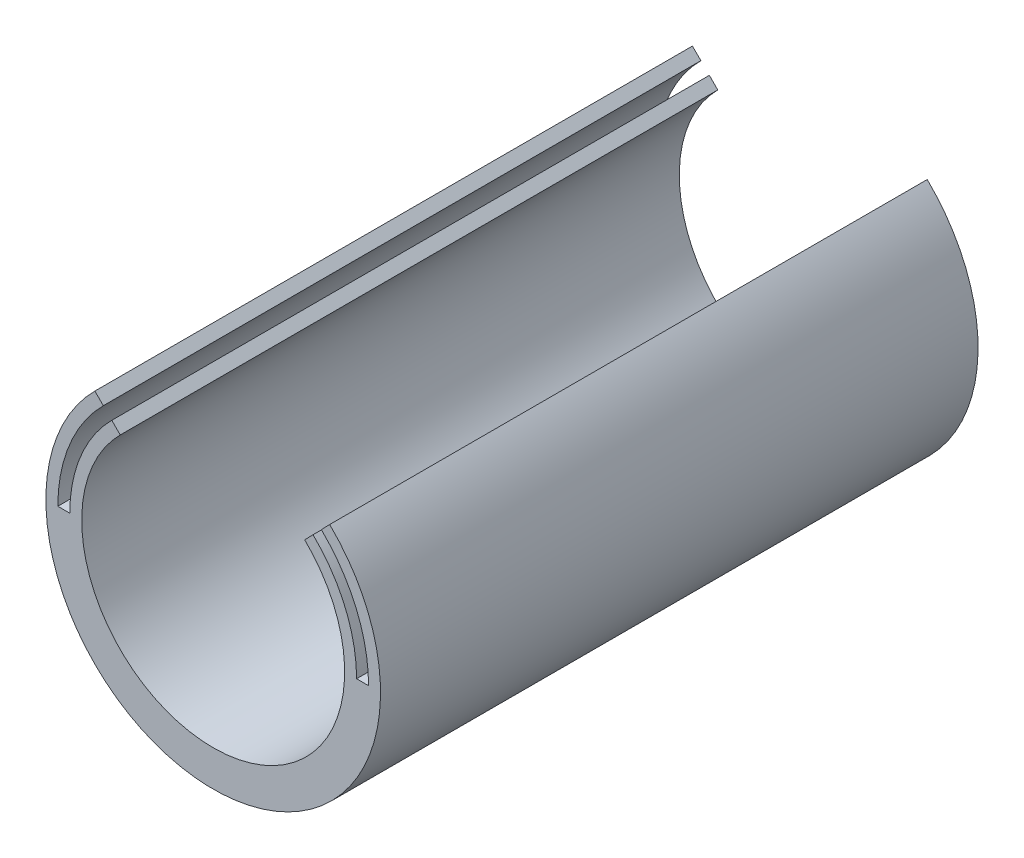
ISO-10303-21;
HEADER;
FILE_DESCRIPTION(('STEP AP214'),'2;1');
FILE_NAME('part.step','',(''),(''),'','','');
FILE_SCHEMA(('AUTOMOTIVE_DESIGN { 1 0 10303 214 1 1 1 1 }'));
ENDSEC;
DATA;
#1=APPLICATION_CONTEXT('core data for automotive mechanical design processes');
#2=APPLICATION_PROTOCOL_DEFINITION('international standard','automotive_design',2000,#1);
#3=PRODUCT_CONTEXT('',#1,'mechanical');
#4=PRODUCT('Part','Part','',(#3));
#5=PRODUCT_RELATED_PRODUCT_CATEGORY('part','',(#4));
#6=PRODUCT_DEFINITION_FORMATION('','',#4);
#7=PRODUCT_DEFINITION_CONTEXT('part definition',#1,'design');
#8=PRODUCT_DEFINITION('design','',#6,#7);
#9=PRODUCT_DEFINITION_SHAPE('','',#8);
#10=(LENGTH_UNIT() NAMED_UNIT(*) SI_UNIT(.MILLI.,.METRE.));
#11=(NAMED_UNIT(*) PLANE_ANGLE_UNIT() SI_UNIT($,.RADIAN.));
#12=(NAMED_UNIT(*) SI_UNIT($,.STERADIAN.) SOLID_ANGLE_UNIT());
#13=UNCERTAINTY_MEASURE_WITH_UNIT(LENGTH_MEASURE(1.E-05),#10,'distance_accuracy_value','');
#14=(GEOMETRIC_REPRESENTATION_CONTEXT(3) GLOBAL_UNCERTAINTY_ASSIGNED_CONTEXT((#13)) GLOBAL_UNIT_ASSIGNED_CONTEXT((#10,
#11,#12)) REPRESENTATION_CONTEXT('',''));
#15=CARTESIAN_POINT('',(0.,0.,0.));
#16=DIRECTION('',(0.,0.,1.));
#17=DIRECTION('',(1.,0.,0.));
#18=AXIS2_PLACEMENT_3D('',#15,#16,#17);
#19=CARTESIAN_POINT('',(15.3152083936225,15.7938086559232,100.));
#20=DIRECTION('',(-0.717900393451055,0.69614583607375,0.));
#21=DIRECTION('',(-0.69614583607375,-0.717900393451055,0.));
#22=AXIS2_PLACEMENT_3D('',#19,#20,#21);
#23=PLANE('',#22);
#24=DIRECTION('',(0.,0.,1.));
#25=VECTOR('',#24,1.);
#26=CARTESIAN_POINT('',(16.70750006577,17.2296094428253,0.));
#27=LINE('',#26,#25);
#28=CARTESIAN_POINT('',(16.70750006577,17.2296094428253,0.));
#29=VERTEX_POINT('',#28);
#30=CARTESIAN_POINT('',(16.70750006577,17.2296094428253,100.));
#31=VERTEX_POINT('',#30);
#32=EDGE_CURVE('E186',#29,#31,#27,.T.);
#33=ORIENTED_EDGE('',*,*,#32,.F.);
#34=DIRECTION('',(0.69614583607375,0.717900393451055,0.));
#35=VECTOR('',#34,1.);
#36=CARTESIAN_POINT('',(15.3152083936225,15.7938086559232,0.));
#37=LINE('',#36,#35);
#38=CARTESIAN_POINT('',(15.3152083936225,15.7938086559232,0.));
#39=VERTEX_POINT('',#38);
#40=EDGE_CURVE('E144',#39,#29,#37,.T.);
#41=ORIENTED_EDGE('',*,*,#40,.F.);
#42=DIRECTION('',(0.,0.,-1.));
#43=VECTOR('',#42,1.);
#44=CARTESIAN_POINT('',(15.3152083936225,15.7938086559232,100.));
#45=LINE('',#44,#43);
#46=CARTESIAN_POINT('',(15.3152083936225,15.7938086559232,100.));
#47=VERTEX_POINT('',#46);
#48=EDGE_CURVE('E147',#47,#39,#45,.T.);
#49=ORIENTED_EDGE('',*,*,#48,.F.);
#50=DIRECTION('',(0.69614583607375,0.717900393451055,0.));
#51=VECTOR('',#50,1.);
#52=CARTESIAN_POINT('',(15.3152083936225,15.7938086559232,100.));
#53=LINE('',#52,#51);
#54=EDGE_CURVE('E180',#47,#31,#53,.T.);
#55=ORIENTED_EDGE('',*,*,#54,.T.);
#56=EDGE_LOOP('',(#33,#41,#49,#55));
#57=FACE_BOUND('',#56,.T.);
#58=ADVANCED_FACE('F34',(#57),#23,.T.);
#59=CARTESIAN_POINT('',(-19.7989898732233,19.7989898732234,100.));
#60=DIRECTION('',(0.707106781186549,0.707106781186546,0.));
#61=DIRECTION('',(-0.707106781186546,0.707106781186549,0.));
#62=AXIS2_PLACEMENT_3D('',#59,#60,#61);
#63=PLANE('',#62);
#64=DIRECTION('',(0.,0.,1.));
#65=VECTOR('',#64,1.);
#66=CARTESIAN_POINT('',(-16.9705627484771,16.9705627484772,0.));
#67=LINE('',#66,#65);
#68=CARTESIAN_POINT('',(-16.9705627484771,16.9705627484772,100.));
#69=VERTEX_POINT('',#68);
#70=CARTESIAN_POINT('',(-16.9705627484771,16.9705627484772,0.));
#71=VERTEX_POINT('',#70);
#72=EDGE_CURVE('E188',#69,#71,#67,.F.);
#73=ORIENTED_EDGE('',*,*,#72,.F.);
#74=DIRECTION('',(0.707106781186546,-0.707106781186549,0.));
#75=VECTOR('',#74,1.);
#76=CARTESIAN_POINT('',(-19.7989898732233,19.7989898732234,100.));
#77=LINE('',#76,#75);
#78=CARTESIAN_POINT('',(-15.556349186104,15.5563491861041,100.));
#79=VERTEX_POINT('',#78);
#80=EDGE_CURVE('E176',#69,#79,#77,.T.);
#81=ORIENTED_EDGE('',*,*,#80,.T.);
#82=DIRECTION('',(0.,0.,-1.));
#83=VECTOR('',#82,1.);
#84=CARTESIAN_POINT('',(-15.556349186104,15.5563491861041,100.));
#85=LINE('',#84,#83);
#86=CARTESIAN_POINT('',(-15.556349186104,15.5563491861041,0.));
#87=VERTEX_POINT('',#86);
#88=EDGE_CURVE('E153',#79,#87,#85,.T.);
#89=ORIENTED_EDGE('',*,*,#88,.T.);
#90=DIRECTION('',(0.707106781186546,-0.707106781186549,0.));
#91=VECTOR('',#90,1.);
#92=CARTESIAN_POINT('',(-19.7989898732233,19.7989898732234,0.));
#93=LINE('',#92,#91);
#94=EDGE_CURVE('E169',#71,#87,#93,.T.);
#95=ORIENTED_EDGE('',*,*,#94,.F.);
#96=EDGE_LOOP('',(#73,#81,#89,#95));
#97=FACE_BOUND('',#96,.T.);
#98=ADVANCED_FACE('F217',(#97),#63,.T.);
#99=DIRECTION('',(0.,0.,1.));
#100=VECTOR('',#99,1.);
#101=CARTESIAN_POINT('',(18.0997917379175,18.6654102297274,0.));
#102=LINE('',#101,#100);
#103=CARTESIAN_POINT('',(18.0997917379175,18.6654102297274,100.));
#104=VERTEX_POINT('',#103);
#105=CARTESIAN_POINT('',(18.0997917379175,18.6654102297274,0.));
#106=VERTEX_POINT('',#105);
#107=EDGE_CURVE('E190',#104,#106,#102,.F.);
#108=ORIENTED_EDGE('',*,*,#107,.F.);
#109=CARTESIAN_POINT('',(19.492083410065,20.1012110166295,100.));
#110=VERTEX_POINT('',#109);
#111=EDGE_CURVE('E183',#104,#110,#53,.T.);
#112=ORIENTED_EDGE('',*,*,#111,.T.);
#113=DIRECTION('',(0.,0.,-1.));
#114=VECTOR('',#113,1.);
#115=CARTESIAN_POINT('',(19.492083410065,20.1012110166295,100.));
#116=LINE('',#115,#114);
#117=CARTESIAN_POINT('',(19.492083410065,20.1012110166295,0.));
#118=VERTEX_POINT('',#117);
#119=EDGE_CURVE('E145',#110,#118,#116,.T.);
#120=ORIENTED_EDGE('',*,*,#119,.T.);
#121=EDGE_CURVE('E173',#106,#118,#37,.T.);
#122=ORIENTED_EDGE('',*,*,#121,.F.);
#123=EDGE_LOOP('',(#108,#112,#120,#122));
#124=FACE_BOUND('',#123,.T.);
#125=ADVANCED_FACE('F36',(#124),#23,.T.);
#126=CARTESIAN_POINT('',(0.,0.,100.));
#127=DIRECTION('',(0.,0.,-1.));
#128=DIRECTION('',(-1.,0.,0.));
#129=AXIS2_PLACEMENT_3D('',#126,#127,#128);
#130=CYLINDRICAL_SURFACE('',#129,22.);
#131=CARTESIAN_POINT('',(0.,0.,0.));
#132=DIRECTION('',(0.,0.,1.));
#133=DIRECTION('',(-1.,0.,0.));
#134=AXIS2_PLACEMENT_3D('',#131,#132,#133);
#135=CIRCLE('',#134,22.);
#136=EDGE_CURVE('E170',#87,#39,#135,.T.);
#137=ORIENTED_EDGE('',*,*,#136,.F.);
#138=ORIENTED_EDGE('',*,*,#88,.F.);
#139=CARTESIAN_POINT('',(0.,0.,100.));
#140=DIRECTION('',(0.,0.,1.));
#141=DIRECTION('',(1.,0.,0.));
#142=AXIS2_PLACEMENT_3D('',#139,#140,#141);
#143=CIRCLE('',#142,22.);
#144=EDGE_CURVE('E177',#79,#47,#143,.T.);
#145=ORIENTED_EDGE('',*,*,#144,.T.);
#146=ORIENTED_EDGE('',*,*,#48,.T.);
#147=EDGE_LOOP('',(#137,#138,#145,#146));
#148=FACE_BOUND('',#147,.T.);
#149=ADVANCED_FACE('F223',(#148),#130,.F.);
#150=DIRECTION('',(0.,0.,1.));
#151=VECTOR('',#150,1.);
#152=CARTESIAN_POINT('',(-18.3847763108502,18.3847763108503,0.));
#153=LINE('',#152,#151);
#154=CARTESIAN_POINT('',(-18.3847763108502,18.3847763108503,0.));
#155=VERTEX_POINT('',#154);
#156=CARTESIAN_POINT('',(-18.3847763108502,18.3847763108503,100.));
#157=VERTEX_POINT('',#156);
#158=EDGE_CURVE('E192',#155,#157,#153,.T.);
#159=ORIENTED_EDGE('',*,*,#158,.F.);
#160=CARTESIAN_POINT('',(-19.7989898732233,19.7989898732234,0.));
#161=VERTEX_POINT('',#160);
#162=EDGE_CURVE('E166',#161,#155,#93,.T.);
#163=ORIENTED_EDGE('',*,*,#162,.F.);
#164=DIRECTION('',(0.,0.,-1.));
#165=VECTOR('',#164,1.);
#166=CARTESIAN_POINT('',(-19.7989898732233,19.7989898732234,100.));
#167=LINE('',#166,#165);
#168=CARTESIAN_POINT('',(-19.7989898732233,19.7989898732234,100.));
#169=VERTEX_POINT('',#168);
#170=EDGE_CURVE('E158',#169,#161,#167,.T.);
#171=ORIENTED_EDGE('',*,*,#170,.F.);
#172=EDGE_CURVE('E161',#169,#157,#77,.T.);
#173=ORIENTED_EDGE('',*,*,#172,.T.);
#174=EDGE_LOOP('',(#159,#163,#171,#173));
#175=FACE_BOUND('',#174,.T.);
#176=ADVANCED_FACE('F240',(#175),#63,.T.);
#177=CARTESIAN_POINT('',(0.,0.,100.));
#178=DIRECTION('',(0.,0.,-1.));
#179=DIRECTION('',(-1.,0.,0.));
#180=AXIS2_PLACEMENT_3D('',#177,#178,#179);
#181=CYLINDRICAL_SURFACE('',#180,28.);
#182=CARTESIAN_POINT('',(0.,0.,0.));
#183=DIRECTION('',(0.,0.,1.));
#184=DIRECTION('',(1.,0.,0.));
#185=AXIS2_PLACEMENT_3D('',#182,#183,#184);
#186=CIRCLE('',#185,28.);
#187=EDGE_CURVE('E162',#161,#118,#186,.T.);
#188=ORIENTED_EDGE('',*,*,#187,.T.);
#189=ORIENTED_EDGE('',*,*,#119,.F.);
#190=CARTESIAN_POINT('',(0.,0.,100.));
#191=DIRECTION('',(0.,0.,1.));
#192=DIRECTION('',(1.,0.,0.));
#193=AXIS2_PLACEMENT_3D('',#190,#191,#192);
#194=CIRCLE('',#193,28.);
#195=EDGE_CURVE('E165',#169,#110,#194,.T.);
#196=ORIENTED_EDGE('',*,*,#195,.F.);
#197=ORIENTED_EDGE('',*,*,#170,.T.);
#198=EDGE_LOOP('',(#188,#189,#196,#197));
#199=FACE_BOUND('',#198,.T.);
#200=ADVANCED_FACE('F234',(#199),#181,.T.);
#201=CARTESIAN_POINT('',(0.,0.,100.));
#202=DIRECTION('',(0.,0.,1.));
#203=DIRECTION('',(1.,0.,0.));
#204=AXIS2_PLACEMENT_3D('',#201,#202,#203);
#205=PLANE('',#204);
#206=CARTESIAN_POINT('',(0.,0.,100.));
#207=DIRECTION('',(0.,0.,-1.));
#208=DIRECTION('',(1.,0.,0.));
#209=AXIS2_PLACEMENT_3D('',#206,#207,#208);
#210=CIRCLE('',#209,24.);
#211=CARTESIAN_POINT('',(-24.,0.,100.));
#212=VERTEX_POINT('',#211);
#213=EDGE_CURVE('E207',#212,#69,#210,.T.);
#214=ORIENTED_EDGE('',*,*,#213,.F.);
#215=DIRECTION('',(1.,0.,0.));
#216=VECTOR('',#215,1.);
#217=CARTESIAN_POINT('',(-26.,0.,100.));
#218=LINE('',#217,#216);
#219=CARTESIAN_POINT('',(-26.,0.,100.));
#220=VERTEX_POINT('',#219);
#221=EDGE_CURVE('E199',#220,#212,#218,.T.);
#222=ORIENTED_EDGE('',*,*,#221,.F.);
#223=CARTESIAN_POINT('',(0.,0.,100.));
#224=DIRECTION('',(0.,0.,1.));
#225=DIRECTION('',(1.,0.,0.));
#226=AXIS2_PLACEMENT_3D('',#223,#224,#225);
#227=CIRCLE('',#226,26.);
#228=EDGE_CURVE('E204',#157,#220,#227,.T.);
#229=ORIENTED_EDGE('',*,*,#228,.F.);
#230=ORIENTED_EDGE('',*,*,#172,.F.);
#231=ORIENTED_EDGE('',*,*,#195,.T.);
#232=ORIENTED_EDGE('',*,*,#111,.F.);
#233=CARTESIAN_POINT('',(26.,0.,100.));
#234=VERTEX_POINT('',#233);
#235=EDGE_CURVE('E202',#234,#104,#227,.T.);
#236=ORIENTED_EDGE('',*,*,#235,.F.);
#237=DIRECTION('',(1.,0.,0.));
#238=VECTOR('',#237,1.);
#239=CARTESIAN_POINT('',(24.,0.,100.));
#240=LINE('',#239,#238);
#241=CARTESIAN_POINT('',(24.,0.,100.));
#242=VERTEX_POINT('',#241);
#243=EDGE_CURVE('E205',#242,#234,#240,.T.);
#244=ORIENTED_EDGE('',*,*,#243,.F.);
#245=EDGE_CURVE('E129',#31,#242,#210,.T.);
#246=ORIENTED_EDGE('',*,*,#245,.F.);
#247=ORIENTED_EDGE('',*,*,#54,.F.);
#248=ORIENTED_EDGE('',*,*,#144,.F.);
#249=ORIENTED_EDGE('',*,*,#80,.F.);
#250=EDGE_LOOP('',(#214,#222,#229,#230,#231,#232,#236,#244,#246,#247,#248,#249));
#251=FACE_BOUND('',#250,.T.);
#252=ADVANCED_FACE('F228',(#251),#205,.T.);
#253=CARTESIAN_POINT('',(0.,0.,0.));
#254=DIRECTION('',(0.,0.,1.));
#255=DIRECTION('',(1.,0.,0.));
#256=AXIS2_PLACEMENT_3D('',#253,#254,#255);
#257=PLANE('',#256);
#258=DIRECTION('',(1.,0.,0.));
#259=VECTOR('',#258,1.);
#260=CARTESIAN_POINT('',(-26.,0.,0.));
#261=LINE('',#260,#259);
#262=CARTESIAN_POINT('',(-26.,0.,0.));
#263=VERTEX_POINT('',#262);
#264=CARTESIAN_POINT('',(-24.,0.,0.));
#265=VERTEX_POINT('',#264);
#266=EDGE_CURVE('E49',#263,#265,#261,.T.);
#267=ORIENTED_EDGE('',*,*,#266,.T.);
#268=CARTESIAN_POINT('',(0.,0.,0.));
#269=DIRECTION('',(0.,0.,-1.));
#270=DIRECTION('',(1.,0.,0.));
#271=AXIS2_PLACEMENT_3D('',#268,#269,#270);
#272=CIRCLE('',#271,24.);
#273=EDGE_CURVE('E139',#265,#71,#272,.T.);
#274=ORIENTED_EDGE('',*,*,#273,.T.);
#275=ORIENTED_EDGE('',*,*,#94,.T.);
#276=ORIENTED_EDGE('',*,*,#136,.T.);
#277=ORIENTED_EDGE('',*,*,#40,.T.);
#278=CARTESIAN_POINT('',(0.,0.,0.));
#279=DIRECTION('',(0.,0.,1.));
#280=DIRECTION('',(1.,0.,0.));
#281=AXIS2_PLACEMENT_3D('',#278,#279,#280);
#282=CIRCLE('',#281,24.);
#283=CARTESIAN_POINT('',(24.,0.,0.));
#284=VERTEX_POINT('',#283);
#285=EDGE_CURVE('E38',#29,#284,#282,.F.);
#286=ORIENTED_EDGE('',*,*,#285,.T.);
#287=DIRECTION('',(1.,0.,0.));
#288=VECTOR('',#287,1.);
#289=CARTESIAN_POINT('',(24.,0.,0.));
#290=LINE('',#289,#288);
#291=CARTESIAN_POINT('',(26.,0.,0.));
#292=VERTEX_POINT('',#291);
#293=EDGE_CURVE('E136',#284,#292,#290,.T.);
#294=ORIENTED_EDGE('',*,*,#293,.T.);
#295=CARTESIAN_POINT('',(0.,0.,0.));
#296=DIRECTION('',(0.,0.,1.));
#297=DIRECTION('',(1.,0.,0.));
#298=AXIS2_PLACEMENT_3D('',#295,#296,#297);
#299=CIRCLE('',#298,26.);
#300=EDGE_CURVE('E57',#292,#106,#299,.T.);
#301=ORIENTED_EDGE('',*,*,#300,.T.);
#302=ORIENTED_EDGE('',*,*,#121,.T.);
#303=ORIENTED_EDGE('',*,*,#187,.F.);
#304=ORIENTED_EDGE('',*,*,#162,.T.);
#305=CARTESIAN_POINT('',(0.,0.,0.));
#306=DIRECTION('',(0.,0.,1.));
#307=DIRECTION('',(1.,0.,0.));
#308=AXIS2_PLACEMENT_3D('',#305,#306,#307);
#309=CIRCLE('',#308,26.);
#310=EDGE_CURVE('E11',#155,#263,#309,.T.);
#311=ORIENTED_EDGE('',*,*,#310,.T.);
#312=EDGE_LOOP('',(#267,#274,#275,#276,#277,#286,#294,#301,#302,#303,#304,#311));
#313=FACE_BOUND('',#312,.T.);
#314=ADVANCED_FACE('F142',(#313),#257,.F.);
#315=CARTESIAN_POINT('',(24.,0.,0.));
#316=DIRECTION('',(0.,-1.,0.));
#317=DIRECTION('',(0.,0.,-1.));
#318=AXIS2_PLACEMENT_3D('',#315,#316,#317);
#319=PLANE('',#318);
#320=ORIENTED_EDGE('',*,*,#243,.T.);
#321=DIRECTION('',(0.,0.,1.));
#322=VECTOR('',#321,1.);
#323=CARTESIAN_POINT('',(26.,0.,0.));
#324=LINE('',#323,#322);
#325=EDGE_CURVE('E133',#292,#234,#324,.T.);
#326=ORIENTED_EDGE('',*,*,#325,.F.);
#327=ORIENTED_EDGE('',*,*,#293,.F.);
#328=DIRECTION('',(0.,0.,1.));
#329=VECTOR('',#328,1.);
#330=CARTESIAN_POINT('',(24.,0.,0.));
#331=LINE('',#330,#329);
#332=EDGE_CURVE('E123',#284,#242,#331,.T.);
#333=ORIENTED_EDGE('',*,*,#332,.T.);
#334=EDGE_LOOP('',(#320,#326,#327,#333));
#335=FACE_BOUND('',#334,.T.);
#336=ADVANCED_FACE('F137',(#335),#319,.F.);
#337=CARTESIAN_POINT('',(0.,0.,0.));
#338=DIRECTION('',(0.,0.,1.));
#339=DIRECTION('',(1.,0.,0.));
#340=AXIS2_PLACEMENT_3D('',#337,#338,#339);
#341=CYLINDRICAL_SURFACE('',#340,26.);
#342=ORIENTED_EDGE('',*,*,#107,.T.);
#343=ORIENTED_EDGE('',*,*,#300,.F.);
#344=ORIENTED_EDGE('',*,*,#325,.T.);
#345=ORIENTED_EDGE('',*,*,#235,.T.);
#346=EDGE_LOOP('',(#342,#343,#344,#345));
#347=FACE_BOUND('',#346,.T.);
#348=ADVANCED_FACE('F232',(#347),#341,.F.);
#349=CARTESIAN_POINT('',(0.,0.,0.));
#350=DIRECTION('',(0.,0.,1.));
#351=DIRECTION('',(1.,0.,0.));
#352=AXIS2_PLACEMENT_3D('',#349,#350,#351);
#353=CYLINDRICAL_SURFACE('',#352,24.);
#354=ORIENTED_EDGE('',*,*,#32,.T.);
#355=ORIENTED_EDGE('',*,*,#245,.T.);
#356=ORIENTED_EDGE('',*,*,#332,.F.);
#357=ORIENTED_EDGE('',*,*,#285,.F.);
#358=EDGE_LOOP('',(#354,#355,#356,#357));
#359=FACE_BOUND('',#358,.T.);
#360=ADVANCED_FACE('F125',(#359),#353,.T.);
#361=ORIENTED_EDGE('',*,*,#72,.T.);
#362=ORIENTED_EDGE('',*,*,#273,.F.);
#363=DIRECTION('',(0.,0.,1.));
#364=VECTOR('',#363,1.);
#365=CARTESIAN_POINT('',(-24.,0.,0.));
#366=LINE('',#365,#364);
#367=EDGE_CURVE('E193',#265,#212,#366,.T.);
#368=ORIENTED_EDGE('',*,*,#367,.T.);
#369=ORIENTED_EDGE('',*,*,#213,.T.);
#370=EDGE_LOOP('',(#361,#362,#368,#369));
#371=FACE_BOUND('',#370,.T.);
#372=ADVANCED_FACE('F246',(#371),#353,.T.);
#373=CARTESIAN_POINT('',(-26.,0.,0.));
#374=DIRECTION('',(0.,-1.,0.));
#375=DIRECTION('',(0.,0.,-1.));
#376=AXIS2_PLACEMENT_3D('',#373,#374,#375);
#377=PLANE('',#376);
#378=ORIENTED_EDGE('',*,*,#221,.T.);
#379=ORIENTED_EDGE('',*,*,#367,.F.);
#380=ORIENTED_EDGE('',*,*,#266,.F.);
#381=DIRECTION('',(0.,0.,1.));
#382=VECTOR('',#381,1.);
#383=CARTESIAN_POINT('',(-26.,0.,0.));
#384=LINE('',#383,#382);
#385=EDGE_CURVE('E196',#263,#220,#384,.T.);
#386=ORIENTED_EDGE('',*,*,#385,.T.);
#387=EDGE_LOOP('',(#378,#379,#380,#386));
#388=FACE_BOUND('',#387,.T.);
#389=ADVANCED_FACE('F245',(#388),#377,.F.);
#390=ORIENTED_EDGE('',*,*,#158,.T.);
#391=ORIENTED_EDGE('',*,*,#228,.T.);
#392=ORIENTED_EDGE('',*,*,#385,.F.);
#393=ORIENTED_EDGE('',*,*,#310,.F.);
#394=EDGE_LOOP('',(#390,#391,#392,#393));
#395=FACE_BOUND('',#394,.T.);
#396=ADVANCED_FACE('F242',(#395),#341,.F.);
#397=CLOSED_SHELL('',(#58,#98,#125,#149,#176,#200,#252,#314,#336,#348,#360,#372,#389,#396));
#398=MANIFOLD_SOLID_BREP('B2',#397);
#399=ADVANCED_BREP_SHAPE_REPRESENTATION('',(#18,#398),#14);
#400=SHAPE_DEFINITION_REPRESENTATION(#9,#399);
ENDSEC;
END-ISO-10303-21;
